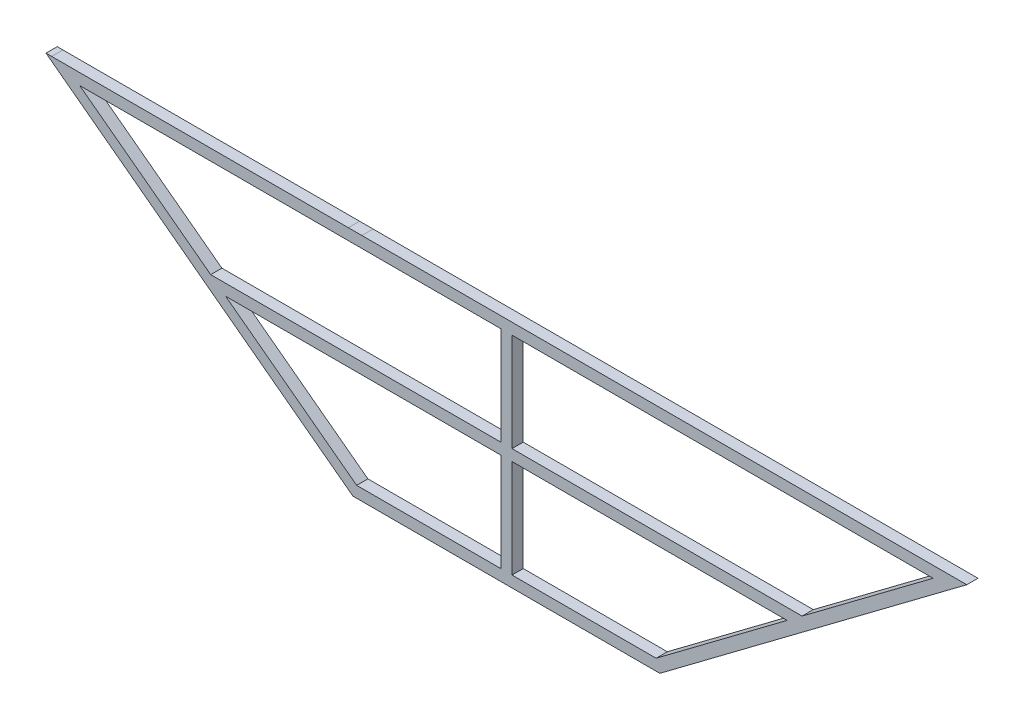
ISO-10303-21;
HEADER;
FILE_DESCRIPTION(('STEP AP214'),'2;1');
FILE_NAME('part.step','',(''),(''),'','','');
FILE_SCHEMA(('AUTOMOTIVE_DESIGN { 1 0 10303 214 1 1 1 1 }'));
ENDSEC;
DATA;
#1=APPLICATION_CONTEXT('core data for automotive mechanical design processes');
#2=APPLICATION_PROTOCOL_DEFINITION('international standard','automotive_design',2000,#1);
#3=PRODUCT_CONTEXT('',#1,'mechanical');
#4=PRODUCT('Part','Part','',(#3));
#5=PRODUCT_RELATED_PRODUCT_CATEGORY('part','',(#4));
#6=PRODUCT_DEFINITION_FORMATION('','',#4);
#7=PRODUCT_DEFINITION_CONTEXT('part definition',#1,'design');
#8=PRODUCT_DEFINITION('design','',#6,#7);
#9=PRODUCT_DEFINITION_SHAPE('','',#8);
#10=(LENGTH_UNIT() NAMED_UNIT(*) SI_UNIT(.MILLI.,.METRE.));
#11=(NAMED_UNIT(*) PLANE_ANGLE_UNIT() SI_UNIT($,.RADIAN.));
#12=(NAMED_UNIT(*) SI_UNIT($,.STERADIAN.) SOLID_ANGLE_UNIT());
#13=UNCERTAINTY_MEASURE_WITH_UNIT(LENGTH_MEASURE(1.E-05),#10,'distance_accuracy_value','');
#14=(GEOMETRIC_REPRESENTATION_CONTEXT(3) GLOBAL_UNCERTAINTY_ASSIGNED_CONTEXT((#13)) GLOBAL_UNIT_ASSIGNED_CONTEXT((#10,
#11,#12)) REPRESENTATION_CONTEXT('',''));
#15=CARTESIAN_POINT('',(0.,0.,0.));
#16=DIRECTION('',(0.,0.,1.));
#17=DIRECTION('',(1.,0.,0.));
#18=AXIS2_PLACEMENT_3D('',#15,#16,#17);
#19=CARTESIAN_POINT('',(-800.,300.,14.63));
#20=DIRECTION('',(0.,-1.,0.));
#21=DIRECTION('',(0.,0.,-1.));
#22=AXIS2_PLACEMENT_3D('',#19,#20,#21);
#23=PLANE('',#22);
#24=DIRECTION('',(0.,0.,-1.));
#25=VECTOR('',#24,1.);
#26=CARTESIAN_POINT('',(-792.599312913207,300.,14.63));
#27=LINE('',#26,#25);
#28=CARTESIAN_POINT('',(-792.599312913207,300.,14.63));
#29=VERTEX_POINT('',#28);
#30=CARTESIAN_POINT('',(-792.599312913207,300.,0.));
#31=VERTEX_POINT('',#30);
#32=EDGE_CURVE('E11',#29,#31,#27,.T.);
#33=ORIENTED_EDGE('',*,*,#32,.F.);
#34=DIRECTION('',(-1.,0.,0.));
#35=VECTOR('',#34,1.);
#36=CARTESIAN_POINT('',(-800.,300.,14.63));
#37=LINE('',#36,#35);
#38=CARTESIAN_POINT('',(-405.922639021753,300.,14.63));
#39=VERTEX_POINT('',#38);
#40=EDGE_CURVE('E438',#39,#29,#37,.T.);
#41=ORIENTED_EDGE('',*,*,#40,.F.);
#42=DIRECTION('',(0.,0.,1.));
#43=VECTOR('',#42,1.);
#44=CARTESIAN_POINT('',(-405.922639021753,300.,14.63));
#45=LINE('',#44,#43);
#46=CARTESIAN_POINT('',(-405.922639021753,300.,0.));
#47=VERTEX_POINT('',#46);
#48=EDGE_CURVE('E387',#47,#39,#45,.T.);
#49=ORIENTED_EDGE('',*,*,#48,.F.);
#50=DIRECTION('',(-1.,0.,0.));
#51=VECTOR('',#50,1.);
#52=CARTESIAN_POINT('',(-800.,300.,0.));
#53=LINE('',#52,#51);
#54=EDGE_CURVE('E425',#47,#31,#53,.T.);
#55=ORIENTED_EDGE('',*,*,#54,.T.);
#56=EDGE_LOOP('',(#33,#41,#49,#55));
#57=FACE_BOUND('',#56,.T.);
#58=ADVANCED_FACE('F44',(#57),#23,.F.);
#59=CARTESIAN_POINT('',(0.,0.,14.63));
#60=DIRECTION('',(0.,1.,0.));
#61=DIRECTION('',(-1.,0.,0.));
#62=AXIS2_PLACEMENT_3D('',#59,#60,#61);
#63=PLANE('',#62);
#64=DIRECTION('',(0.,0.,-1.));
#65=VECTOR('',#64,1.);
#66=CARTESIAN_POINT('',(-14.4940912011187,0.,14.63));
#67=LINE('',#66,#65);
#68=CARTESIAN_POINT('',(-14.4940912011187,0.,14.63));
#69=VERTEX_POINT('',#68);
#70=CARTESIAN_POINT('',(-14.4940912011187,0.,0.));
#71=VERTEX_POINT('',#70);
#72=EDGE_CURVE('E53',#69,#71,#67,.T.);
#73=ORIENTED_EDGE('',*,*,#72,.F.);
#74=DIRECTION('',(1.,0.,0.));
#75=VECTOR('',#74,1.);
#76=CARTESIAN_POINT('',(0.,0.,14.63));
#77=LINE('',#76,#75);
#78=CARTESIAN_POINT('',(-388.333806642396,0.,14.63));
#79=VERTEX_POINT('',#78);
#80=EDGE_CURVE('E359',#79,#69,#77,.T.);
#81=ORIENTED_EDGE('',*,*,#80,.F.);
#82=DIRECTION('',(0.,0.,1.));
#83=VECTOR('',#82,1.);
#84=CARTESIAN_POINT('',(-388.333806642396,0.,14.63));
#85=LINE('',#84,#83);
#86=CARTESIAN_POINT('',(-388.333806642396,0.,0.));
#87=VERTEX_POINT('',#86);
#88=EDGE_CURVE('E386',#87,#79,#85,.T.);
#89=ORIENTED_EDGE('',*,*,#88,.F.);
#90=DIRECTION('',(1.,0.,0.));
#91=VECTOR('',#90,1.);
#92=CARTESIAN_POINT('',(0.,0.,0.));
#93=LINE('',#92,#91);
#94=EDGE_CURVE('E373',#87,#71,#93,.T.);
#95=ORIENTED_EDGE('',*,*,#94,.T.);
#96=EDGE_LOOP('',(#73,#81,#89,#95));
#97=FACE_BOUND('',#96,.T.);
#98=ADVANCED_FACE('F413',(#97),#63,.F.);
#99=CARTESIAN_POINT('',(0.,0.,14.63));
#100=VERTEX_POINT('',#99);
#101=EDGE_CURVE('E354',#69,#100,#77,.T.);
#102=ORIENTED_EDGE('',*,*,#101,.F.);
#103=ORIENTED_EDGE('',*,*,#72,.T.);
#104=CARTESIAN_POINT('',(0.,0.,0.));
#105=VERTEX_POINT('',#104);
#106=EDGE_CURVE('E369',#71,#105,#93,.T.);
#107=ORIENTED_EDGE('',*,*,#106,.T.);
#108=DIRECTION('',(0.,0.,-1.));
#109=VECTOR('',#108,1.);
#110=CARTESIAN_POINT('',(0.,0.,14.63));
#111=LINE('',#110,#109);
#112=EDGE_CURVE('E360',#100,#105,#111,.T.);
#113=ORIENTED_EDGE('',*,*,#112,.F.);
#114=EDGE_LOOP('',(#102,#103,#107,#113));
#115=FACE_BOUND('',#114,.T.);
#116=ADVANCED_FACE('F398',(#115),#63,.F.);
#117=CARTESIAN_POINT('',(-800.,300.,14.63));
#118=VERTEX_POINT('',#117);
#119=EDGE_CURVE('E350',#29,#118,#37,.T.);
#120=ORIENTED_EDGE('',*,*,#119,.F.);
#121=ORIENTED_EDGE('',*,*,#32,.T.);
#122=CARTESIAN_POINT('',(-800.,300.,0.));
#123=VERTEX_POINT('',#122);
#124=EDGE_CURVE('E361',#31,#123,#53,.T.);
#125=ORIENTED_EDGE('',*,*,#124,.T.);
#126=DIRECTION('',(0.,0.,-1.));
#127=VECTOR('',#126,1.);
#128=CARTESIAN_POINT('',(-800.,300.,14.63));
#129=LINE('',#128,#127);
#130=EDGE_CURVE('E378',#118,#123,#129,.T.);
#131=ORIENTED_EDGE('',*,*,#130,.F.);
#132=EDGE_LOOP('',(#120,#121,#125,#131));
#133=FACE_BOUND('',#132,.T.);
#134=ADVANCED_FACE('F422',(#133),#23,.F.);
#135=DIRECTION('',(0.,0.,-1.));
#136=VECTOR('',#135,1.);
#137=CARTESIAN_POINT('',(-388.333806642396,300.,14.63));
#138=LINE('',#137,#136);
#139=CARTESIAN_POINT('',(-388.333806642396,300.,14.63));
#140=VERTEX_POINT('',#139);
#141=CARTESIAN_POINT('',(-388.333806642396,300.,0.));
#142=VERTEX_POINT('',#141);
#143=EDGE_CURVE('E383',#140,#142,#138,.T.);
#144=ORIENTED_EDGE('',*,*,#143,.F.);
#145=CARTESIAN_POINT('',(400.,300.,14.63));
#146=VERTEX_POINT('',#145);
#147=EDGE_CURVE('E347',#146,#140,#37,.T.);
#148=ORIENTED_EDGE('',*,*,#147,.F.);
#149=DIRECTION('',(0.,0.,-1.));
#150=VECTOR('',#149,1.);
#151=CARTESIAN_POINT('',(400.,300.,14.63));
#152=LINE('',#151,#150);
#153=CARTESIAN_POINT('',(400.,300.,0.));
#154=VERTEX_POINT('',#153);
#155=EDGE_CURVE('E385',#146,#154,#152,.T.);
#156=ORIENTED_EDGE('',*,*,#155,.T.);
#157=EDGE_CURVE('E364',#154,#142,#53,.T.);
#158=ORIENTED_EDGE('',*,*,#157,.T.);
#159=EDGE_LOOP('',(#144,#148,#156,#158));
#160=FACE_BOUND('',#159,.T.);
#161=ADVANCED_FACE('F431',(#160),#23,.F.);
#162=CARTESIAN_POINT('',(0.,0.,14.63));
#163=DIRECTION('',(0.,0.,-1.));
#164=DIRECTION('',(-1.,0.,0.));
#165=AXIS2_PLACEMENT_3D('',#162,#163,#164);
#166=PLANE('',#165);
#167=DIRECTION('',(1.,0.,0.));
#168=VECTOR('',#167,1.);
#169=CARTESIAN_POINT('',(-575.616666666667,157.315,14.63));
#170=LINE('',#169,#168);
#171=CARTESIAN_POINT('',(-585.37,157.315,14.63));
#172=VERTEX_POINT('',#171);
#173=CARTESIAN_POINT('',(-207.315,157.315,14.63));
#174=VERTEX_POINT('',#173);
#175=EDGE_CURVE('E254',#172,#174,#170,.T.);
#176=ORIENTED_EDGE('',*,*,#175,.F.);
#177=DIRECTION('',(0.8,-0.6,0.));
#178=VECTOR('',#177,1.);
#179=CARTESIAN_POINT('',(-585.37,157.315,14.63));
#180=LINE('',#179,#178);
#181=CARTESIAN_POINT('',(-756.11,285.37,14.63));
#182=VERTEX_POINT('',#181);
#183=EDGE_CURVE('E263',#182,#172,#180,.T.);
#184=ORIENTED_EDGE('',*,*,#183,.F.);
#185=DIRECTION('',(-1.,0.,0.));
#186=VECTOR('',#185,1.);
#187=CARTESIAN_POINT('',(-756.11,285.37,14.63));
#188=LINE('',#187,#186);
#189=CARTESIAN_POINT('',(-207.315,285.37,14.63));
#190=VERTEX_POINT('',#189);
#191=EDGE_CURVE('E259',#190,#182,#188,.T.);
#192=ORIENTED_EDGE('',*,*,#191,.F.);
#193=DIRECTION('',(0.,1.,0.));
#194=VECTOR('',#193,1.);
#195=CARTESIAN_POINT('',(-207.315,157.315,14.63));
#196=LINE('',#195,#194);
#197=EDGE_CURVE('E253',#174,#190,#196,.T.);
#198=ORIENTED_EDGE('',*,*,#197,.F.);
#199=EDGE_LOOP('',(#176,#184,#192,#198));
#200=FACE_BOUND('',#199,.T.);
#201=DIRECTION('',(0.,-1.,0.));
#202=VECTOR('',#201,1.);
#203=CARTESIAN_POINT('',(-192.685,14.63,14.63));
#204=LINE('',#203,#202);
#205=CARTESIAN_POINT('',(-192.685,142.685,14.63));
#206=VERTEX_POINT('',#205);
#207=CARTESIAN_POINT('',(-192.685,14.63,14.63));
#208=VERTEX_POINT('',#207);
#209=EDGE_CURVE('E312',#206,#208,#204,.T.);
#210=ORIENTED_EDGE('',*,*,#209,.F.);
#211=DIRECTION('',(-1.,0.,0.));
#212=VECTOR('',#211,1.);
#213=CARTESIAN_POINT('',(-192.685,142.685,14.63));
#214=LINE('',#213,#212);
#215=CARTESIAN_POINT('',(165.863333333333,142.685,14.63));
#216=VERTEX_POINT('',#215);
#217=EDGE_CURVE('E322',#216,#206,#214,.T.);
#218=ORIENTED_EDGE('',*,*,#217,.F.);
#219=DIRECTION('',(0.8,0.6,0.));
#220=VECTOR('',#219,1.);
#221=CARTESIAN_POINT('',(165.863333333333,142.685,14.63));
#222=LINE('',#221,#220);
#223=CARTESIAN_POINT('',(-4.87666666666669,14.63,14.63));
#224=VERTEX_POINT('',#223);
#225=EDGE_CURVE('E319',#224,#216,#222,.T.);
#226=ORIENTED_EDGE('',*,*,#225,.F.);
#227=DIRECTION('',(1.,0.,0.));
#228=VECTOR('',#227,1.);
#229=CARTESIAN_POINT('',(-4.87666666666669,14.63,14.63));
#230=LINE('',#229,#228);
#231=EDGE_CURVE('E314',#208,#224,#230,.T.);
#232=ORIENTED_EDGE('',*,*,#231,.F.);
#233=EDGE_LOOP('',(#210,#218,#226,#232));
#234=FACE_BOUND('',#233,.T.);
#235=DIRECTION('',(0.8,0.6,0.));
#236=VECTOR('',#235,1.);
#237=CARTESIAN_POINT('',(400.,300.,14.63));
#238=LINE('',#237,#236);
#239=EDGE_CURVE('E341',#100,#146,#238,.T.);
#240=ORIENTED_EDGE('',*,*,#239,.T.);
#241=ORIENTED_EDGE('',*,*,#147,.T.);
#242=EDGE_CURVE('E352',#140,#39,#37,.T.);
#243=ORIENTED_EDGE('',*,*,#242,.T.);
#244=ORIENTED_EDGE('',*,*,#40,.T.);
#245=ORIENTED_EDGE('',*,*,#119,.T.);
#246=DIRECTION('',(0.8,-0.6,0.));
#247=VECTOR('',#246,1.);
#248=CARTESIAN_POINT('',(-400.,0.,14.63));
#249=LINE('',#248,#247);
#250=CARTESIAN_POINT('',(-400.,0.,14.63));
#251=VERTEX_POINT('',#250);
#252=EDGE_CURVE('E355',#118,#251,#249,.T.);
#253=ORIENTED_EDGE('',*,*,#252,.T.);
#254=EDGE_CURVE('E358',#251,#79,#77,.T.);
#255=ORIENTED_EDGE('',*,*,#254,.T.);
#256=ORIENTED_EDGE('',*,*,#80,.T.);
#257=ORIENTED_EDGE('',*,*,#101,.T.);
#258=EDGE_LOOP('',(#240,#241,#243,#244,#245,#253,#255,#256,#257));
#259=FACE_BOUND('',#258,.T.);
#260=DIRECTION('',(0.,-1.,0.));
#261=VECTOR('',#260,1.);
#262=CARTESIAN_POINT('',(-192.685,157.315,14.63));
#263=LINE('',#262,#261);
#264=CARTESIAN_POINT('',(-192.685,285.37,14.63));
#265=VERTEX_POINT('',#264);
#266=CARTESIAN_POINT('',(-192.685,157.315,14.63));
#267=VERTEX_POINT('',#266);
#268=EDGE_CURVE('E285',#265,#267,#263,.T.);
#269=ORIENTED_EDGE('',*,*,#268,.F.);
#270=DIRECTION('',(-1.,0.,0.));
#271=VECTOR('',#270,1.);
#272=CARTESIAN_POINT('',(-192.685,285.37,14.63));
#273=LINE('',#272,#271);
#274=CARTESIAN_POINT('',(356.11,285.37,14.63));
#275=VERTEX_POINT('',#274);
#276=EDGE_CURVE('E289',#275,#265,#273,.T.);
#277=ORIENTED_EDGE('',*,*,#276,.F.);
#278=DIRECTION('',(0.8,0.6,0.));
#279=VECTOR('',#278,1.);
#280=CARTESIAN_POINT('',(356.11,285.37,14.63));
#281=LINE('',#280,#279);
#282=CARTESIAN_POINT('',(185.37,157.315,14.63));
#283=VERTEX_POINT('',#282);
#284=EDGE_CURVE('E290',#283,#275,#281,.T.);
#285=ORIENTED_EDGE('',*,*,#284,.F.);
#286=DIRECTION('',(1.,0.,0.));
#287=VECTOR('',#286,1.);
#288=CARTESIAN_POINT('',(-192.685,157.315,14.63));
#289=LINE('',#288,#287);
#290=EDGE_CURVE('E282',#267,#283,#289,.T.);
#291=ORIENTED_EDGE('',*,*,#290,.F.);
#292=EDGE_LOOP('',(#269,#277,#285,#291));
#293=FACE_BOUND('',#292,.T.);
#294=DIRECTION('',(1.,0.,0.));
#295=VECTOR('',#294,1.);
#296=CARTESIAN_POINT('',(-207.315,14.63,14.63));
#297=LINE('',#296,#295);
#298=CARTESIAN_POINT('',(-395.123333333333,14.63,14.63));
#299=VERTEX_POINT('',#298);
#300=CARTESIAN_POINT('',(-207.315,14.63,14.63));
#301=VERTEX_POINT('',#300);
#302=EDGE_CURVE('E212',#299,#301,#297,.T.);
#303=ORIENTED_EDGE('',*,*,#302,.F.);
#304=DIRECTION('',(0.8,-0.6,0.));
#305=VECTOR('',#304,1.);
#306=CARTESIAN_POINT('',(-395.123333333333,14.63,14.63));
#307=LINE('',#306,#305);
#308=CARTESIAN_POINT('',(-565.863333333333,142.685,14.63));
#309=VERTEX_POINT('',#308);
#310=EDGE_CURVE('E240',#309,#299,#307,.T.);
#311=ORIENTED_EDGE('',*,*,#310,.F.);
#312=DIRECTION('',(-1.,0.,0.));
#313=VECTOR('',#312,1.);
#314=CARTESIAN_POINT('',(-565.863333333333,142.685,14.63));
#315=LINE('',#314,#313);
#316=CARTESIAN_POINT('',(-207.315,142.685,14.63));
#317=VERTEX_POINT('',#316);
#318=EDGE_CURVE('E232',#317,#309,#315,.T.);
#319=ORIENTED_EDGE('',*,*,#318,.F.);
#320=DIRECTION('',(0.,1.,0.));
#321=VECTOR('',#320,1.);
#322=CARTESIAN_POINT('',(-207.315,14.63,14.63));
#323=LINE('',#322,#321);
#324=EDGE_CURVE('E221',#301,#317,#323,.T.);
#325=ORIENTED_EDGE('',*,*,#324,.F.);
#326=EDGE_LOOP('',(#303,#311,#319,#325));
#327=FACE_BOUND('',#326,.T.);
#328=ADVANCED_FACE('F231',(#200,#234,#259,#293,#327),#166,.F.);
#329=CARTESIAN_POINT('',(0.,0.,0.));
#330=DIRECTION('',(0.,0.,-1.));
#331=DIRECTION('',(-1.,0.,0.));
#332=AXIS2_PLACEMENT_3D('',#329,#330,#331);
#333=PLANE('',#332);
#334=DIRECTION('',(0.8,0.6,0.));
#335=VECTOR('',#334,1.);
#336=CARTESIAN_POINT('',(400.,300.,0.));
#337=LINE('',#336,#335);
#338=EDGE_CURVE('E344',#105,#154,#337,.T.);
#339=ORIENTED_EDGE('',*,*,#338,.F.);
#340=ORIENTED_EDGE('',*,*,#106,.F.);
#341=ORIENTED_EDGE('',*,*,#94,.F.);
#342=CARTESIAN_POINT('',(-400.,0.,0.));
#343=VERTEX_POINT('',#342);
#344=EDGE_CURVE('E346',#343,#87,#93,.T.);
#345=ORIENTED_EDGE('',*,*,#344,.F.);
#346=DIRECTION('',(0.8,-0.6,0.));
#347=VECTOR('',#346,1.);
#348=CARTESIAN_POINT('',(-400.,0.,0.));
#349=LINE('',#348,#347);
#350=EDGE_CURVE('E370',#123,#343,#349,.T.);
#351=ORIENTED_EDGE('',*,*,#350,.F.);
#352=ORIENTED_EDGE('',*,*,#124,.F.);
#353=ORIENTED_EDGE('',*,*,#54,.F.);
#354=EDGE_CURVE('E368',#142,#47,#53,.T.);
#355=ORIENTED_EDGE('',*,*,#354,.F.);
#356=ORIENTED_EDGE('',*,*,#157,.F.);
#357=EDGE_LOOP('',(#339,#340,#341,#345,#351,#352,#353,#355,#356));
#358=FACE_BOUND('',#357,.T.);
#359=DIRECTION('',(-1.,0.,0.));
#360=VECTOR('',#359,1.);
#361=CARTESIAN_POINT('',(-192.685,142.685,0.));
#362=LINE('',#361,#360);
#363=CARTESIAN_POINT('',(165.863333333333,142.685,0.));
#364=VERTEX_POINT('',#363);
#365=CARTESIAN_POINT('',(-192.685,142.685,0.));
#366=VERTEX_POINT('',#365);
#367=EDGE_CURVE('E317',#364,#366,#362,.T.);
#368=ORIENTED_EDGE('',*,*,#367,.T.);
#369=DIRECTION('',(0.,-1.,0.));
#370=VECTOR('',#369,1.);
#371=CARTESIAN_POINT('',(-192.685,14.63,0.));
#372=LINE('',#371,#370);
#373=CARTESIAN_POINT('',(-192.685,14.63,0.));
#374=VERTEX_POINT('',#373);
#375=EDGE_CURVE('E315',#366,#374,#372,.T.);
#376=ORIENTED_EDGE('',*,*,#375,.T.);
#377=DIRECTION('',(1.,0.,0.));
#378=VECTOR('',#377,1.);
#379=CARTESIAN_POINT('',(-4.87666666666669,14.63,0.));
#380=LINE('',#379,#378);
#381=CARTESIAN_POINT('',(-4.87666666666669,14.63,0.));
#382=VERTEX_POINT('',#381);
#383=EDGE_CURVE('E328',#374,#382,#380,.T.);
#384=ORIENTED_EDGE('',*,*,#383,.T.);
#385=DIRECTION('',(0.8,0.6,0.));
#386=VECTOR('',#385,1.);
#387=CARTESIAN_POINT('',(165.863333333333,142.685,0.));
#388=LINE('',#387,#386);
#389=EDGE_CURVE('E327',#382,#364,#388,.T.);
#390=ORIENTED_EDGE('',*,*,#389,.T.);
#391=EDGE_LOOP('',(#368,#376,#384,#390));
#392=FACE_BOUND('',#391,.T.);
#393=DIRECTION('',(-1.,0.,0.));
#394=VECTOR('',#393,1.);
#395=CARTESIAN_POINT('',(-192.685,285.37,0.));
#396=LINE('',#395,#394);
#397=CARTESIAN_POINT('',(356.11,285.37,0.));
#398=VERTEX_POINT('',#397);
#399=CARTESIAN_POINT('',(-192.685,285.37,0.));
#400=VERTEX_POINT('',#399);
#401=EDGE_CURVE('E284',#398,#400,#396,.T.);
#402=ORIENTED_EDGE('',*,*,#401,.T.);
#403=DIRECTION('',(0.,-1.,0.));
#404=VECTOR('',#403,1.);
#405=CARTESIAN_POINT('',(-192.685,157.315,0.));
#406=LINE('',#405,#404);
#407=CARTESIAN_POINT('',(-192.685,157.315,0.));
#408=VERTEX_POINT('',#407);
#409=EDGE_CURVE('E283',#400,#408,#406,.T.);
#410=ORIENTED_EDGE('',*,*,#409,.T.);
#411=DIRECTION('',(1.,0.,0.));
#412=VECTOR('',#411,1.);
#413=CARTESIAN_POINT('',(175.161951026694,157.315,0.));
#414=LINE('',#413,#412);
#415=CARTESIAN_POINT('',(185.37,157.315,0.));
#416=VERTEX_POINT('',#415);
#417=EDGE_CURVE('E294',#408,#416,#414,.T.);
#418=ORIENTED_EDGE('',*,*,#417,.T.);
#419=DIRECTION('',(0.8,0.6,0.));
#420=VECTOR('',#419,1.);
#421=CARTESIAN_POINT('',(356.11,285.37,0.));
#422=LINE('',#421,#420);
#423=EDGE_CURVE('E296',#416,#398,#422,.T.);
#424=ORIENTED_EDGE('',*,*,#423,.T.);
#425=EDGE_LOOP('',(#402,#410,#418,#424));
#426=FACE_BOUND('',#425,.T.);
#427=DIRECTION('',(0.8,-0.6,0.));
#428=VECTOR('',#427,1.);
#429=CARTESIAN_POINT('',(-585.37,157.315,0.));
#430=LINE('',#429,#428);
#431=CARTESIAN_POINT('',(-756.11,285.37,0.));
#432=VERTEX_POINT('',#431);
#433=CARTESIAN_POINT('',(-585.37,157.315,0.));
#434=VERTEX_POINT('',#433);
#435=EDGE_CURVE('E257',#432,#434,#430,.T.);
#436=ORIENTED_EDGE('',*,*,#435,.T.);
#437=DIRECTION('',(1.,0.,0.));
#438=VECTOR('',#437,1.);
#439=CARTESIAN_POINT('',(-575.616666666667,157.315,0.));
#440=LINE('',#439,#438);
#441=CARTESIAN_POINT('',(-207.315,157.315,0.));
#442=VERTEX_POINT('',#441);
#443=EDGE_CURVE('E230',#434,#442,#440,.T.);
#444=ORIENTED_EDGE('',*,*,#443,.T.);
#445=DIRECTION('',(0.,1.,0.));
#446=VECTOR('',#445,1.);
#447=CARTESIAN_POINT('',(-207.315,157.315,0.));
#448=LINE('',#447,#446);
#449=CARTESIAN_POINT('',(-207.315,285.37,0.));
#450=VERTEX_POINT('',#449);
#451=EDGE_CURVE('E266',#442,#450,#448,.T.);
#452=ORIENTED_EDGE('',*,*,#451,.T.);
#453=DIRECTION('',(-1.,0.,0.));
#454=VECTOR('',#453,1.);
#455=CARTESIAN_POINT('',(-756.11,285.37,0.));
#456=LINE('',#455,#454);
#457=EDGE_CURVE('E268',#450,#432,#456,.T.);
#458=ORIENTED_EDGE('',*,*,#457,.T.);
#459=EDGE_LOOP('',(#436,#444,#452,#458));
#460=FACE_BOUND('',#459,.T.);
#461=DIRECTION('',(0.8,-0.6,0.));
#462=VECTOR('',#461,1.);
#463=CARTESIAN_POINT('',(-395.123333333333,14.63,0.));
#464=LINE('',#463,#462);
#465=CARTESIAN_POINT('',(-565.863333333333,142.685,0.));
#466=VERTEX_POINT('',#465);
#467=CARTESIAN_POINT('',(-395.123333333333,14.63,0.));
#468=VERTEX_POINT('',#467);
#469=EDGE_CURVE('E225',#466,#468,#464,.T.);
#470=ORIENTED_EDGE('',*,*,#469,.T.);
#471=DIRECTION('',(1.,0.,0.));
#472=VECTOR('',#471,1.);
#473=CARTESIAN_POINT('',(-207.315,14.63,0.));
#474=LINE('',#473,#472);
#475=CARTESIAN_POINT('',(-207.315,14.63,0.));
#476=VERTEX_POINT('',#475);
#477=EDGE_CURVE('E241',#468,#476,#474,.T.);
#478=ORIENTED_EDGE('',*,*,#477,.T.);
#479=DIRECTION('',(0.,1.,0.));
#480=VECTOR('',#479,1.);
#481=CARTESIAN_POINT('',(-207.315,14.63,0.));
#482=LINE('',#481,#480);
#483=CARTESIAN_POINT('',(-207.315,142.685,0.));
#484=VERTEX_POINT('',#483);
#485=EDGE_CURVE('E226',#476,#484,#482,.T.);
#486=ORIENTED_EDGE('',*,*,#485,.T.);
#487=DIRECTION('',(-1.,0.,0.));
#488=VECTOR('',#487,1.);
#489=CARTESIAN_POINT('',(-565.863333333333,142.685,0.));
#490=LINE('',#489,#488);
#491=EDGE_CURVE('E242',#484,#466,#490,.T.);
#492=ORIENTED_EDGE('',*,*,#491,.T.);
#493=EDGE_LOOP('',(#470,#478,#486,#492));
#494=FACE_BOUND('',#493,.T.);
#495=ADVANCED_FACE('F409',(#358,#392,#426,#460,#494),#333,.T.);
#496=CARTESIAN_POINT('',(400.,300.,14.63));
#497=DIRECTION('',(-0.6,0.8,0.));
#498=DIRECTION('',(-0.8,-0.6,0.));
#499=AXIS2_PLACEMENT_3D('',#496,#497,#498);
#500=PLANE('',#499);
#501=ORIENTED_EDGE('',*,*,#338,.T.);
#502=ORIENTED_EDGE('',*,*,#155,.F.);
#503=ORIENTED_EDGE('',*,*,#239,.F.);
#504=ORIENTED_EDGE('',*,*,#112,.T.);
#505=EDGE_LOOP('',(#501,#502,#503,#504));
#506=FACE_BOUND('',#505,.T.);
#507=ADVANCED_FACE('F50',(#506),#500,.F.);
#508=ORIENTED_EDGE('',*,*,#354,.T.);
#509=ORIENTED_EDGE('',*,*,#48,.T.);
#510=ORIENTED_EDGE('',*,*,#242,.F.);
#511=ORIENTED_EDGE('',*,*,#143,.T.);
#512=EDGE_LOOP('',(#508,#509,#510,#511));
#513=FACE_BOUND('',#512,.T.);
#514=ADVANCED_FACE('F426',(#513),#23,.F.);
#515=CARTESIAN_POINT('',(-400.,0.,14.63));
#516=DIRECTION('',(0.6,0.8,0.));
#517=DIRECTION('',(-0.8,0.6,0.));
#518=AXIS2_PLACEMENT_3D('',#515,#516,#517);
#519=PLANE('',#518);
#520=ORIENTED_EDGE('',*,*,#350,.T.);
#521=DIRECTION('',(0.,0.,-1.));
#522=VECTOR('',#521,1.);
#523=CARTESIAN_POINT('',(-400.,0.,14.63));
#524=LINE('',#523,#522);
#525=EDGE_CURVE('E376',#251,#343,#524,.T.);
#526=ORIENTED_EDGE('',*,*,#525,.F.);
#527=ORIENTED_EDGE('',*,*,#252,.F.);
#528=ORIENTED_EDGE('',*,*,#130,.T.);
#529=EDGE_LOOP('',(#520,#526,#527,#528));
#530=FACE_BOUND('',#529,.T.);
#531=ADVANCED_FACE('F418',(#530),#519,.F.);
#532=ORIENTED_EDGE('',*,*,#344,.T.);
#533=ORIENTED_EDGE('',*,*,#88,.T.);
#534=ORIENTED_EDGE('',*,*,#254,.F.);
#535=ORIENTED_EDGE('',*,*,#525,.T.);
#536=EDGE_LOOP('',(#532,#533,#534,#535));
#537=FACE_BOUND('',#536,.T.);
#538=ADVANCED_FACE('F412',(#537),#63,.F.);
#539=CARTESIAN_POINT('',(-192.685,14.63,14.63));
#540=DIRECTION('',(1.,0.,0.));
#541=DIRECTION('',(0.,1.,0.));
#542=AXIS2_PLACEMENT_3D('',#539,#540,#541);
#543=PLANE('',#542);
#544=ORIENTED_EDGE('',*,*,#375,.F.);
#545=DIRECTION('',(0.,0.,-1.));
#546=VECTOR('',#545,1.);
#547=CARTESIAN_POINT('',(-192.685,142.685,14.63));
#548=LINE('',#547,#546);
#549=EDGE_CURVE('E324',#206,#366,#548,.T.);
#550=ORIENTED_EDGE('',*,*,#549,.F.);
#551=ORIENTED_EDGE('',*,*,#209,.T.);
#552=DIRECTION('',(0.,0.,-1.));
#553=VECTOR('',#552,1.);
#554=CARTESIAN_POINT('',(-192.685,14.63,14.63));
#555=LINE('',#554,#553);
#556=EDGE_CURVE('E338',#208,#374,#555,.T.);
#557=ORIENTED_EDGE('',*,*,#556,.T.);
#558=EDGE_LOOP('',(#544,#550,#551,#557));
#559=FACE_BOUND('',#558,.T.);
#560=ADVANCED_FACE('F470',(#559),#543,.T.);
#561=CARTESIAN_POINT('',(-4.87666666666669,14.63,14.63));
#562=DIRECTION('',(0.,1.,0.));
#563=DIRECTION('',(0.,0.,1.));
#564=AXIS2_PLACEMENT_3D('',#561,#562,#563);
#565=PLANE('',#564);
#566=ORIENTED_EDGE('',*,*,#383,.F.);
#567=ORIENTED_EDGE('',*,*,#556,.F.);
#568=ORIENTED_EDGE('',*,*,#231,.T.);
#569=DIRECTION('',(0.,0.,-1.));
#570=VECTOR('',#569,1.);
#571=CARTESIAN_POINT('',(-4.87666666666669,14.63,14.63));
#572=LINE('',#571,#570);
#573=EDGE_CURVE('E336',#224,#382,#572,.T.);
#574=ORIENTED_EDGE('',*,*,#573,.T.);
#575=EDGE_LOOP('',(#566,#567,#568,#574));
#576=FACE_BOUND('',#575,.T.);
#577=ADVANCED_FACE('F475',(#576),#565,.T.);
#578=CARTESIAN_POINT('',(165.863333333333,142.685,14.63));
#579=DIRECTION('',(-0.6,0.8,0.));
#580=DIRECTION('',(-0.8,-0.6,0.));
#581=AXIS2_PLACEMENT_3D('',#578,#579,#580);
#582=PLANE('',#581);
#583=ORIENTED_EDGE('',*,*,#389,.F.);
#584=ORIENTED_EDGE('',*,*,#573,.F.);
#585=ORIENTED_EDGE('',*,*,#225,.T.);
#586=DIRECTION('',(0.,0.,-1.));
#587=VECTOR('',#586,1.);
#588=CARTESIAN_POINT('',(165.863333333333,142.685,14.63));
#589=LINE('',#588,#587);
#590=EDGE_CURVE('E337',#216,#364,#589,.T.);
#591=ORIENTED_EDGE('',*,*,#590,.T.);
#592=EDGE_LOOP('',(#583,#584,#585,#591));
#593=FACE_BOUND('',#592,.T.);
#594=ADVANCED_FACE('F624',(#593),#582,.T.);
#595=CARTESIAN_POINT('',(-192.685,142.685,14.63));
#596=DIRECTION('',(0.,-1.,0.));
#597=DIRECTION('',(0.,0.,-1.));
#598=AXIS2_PLACEMENT_3D('',#595,#596,#597);
#599=PLANE('',#598);
#600=ORIENTED_EDGE('',*,*,#367,.F.);
#601=ORIENTED_EDGE('',*,*,#590,.F.);
#602=ORIENTED_EDGE('',*,*,#217,.T.);
#603=ORIENTED_EDGE('',*,*,#549,.T.);
#604=EDGE_LOOP('',(#600,#601,#602,#603));
#605=FACE_BOUND('',#604,.T.);
#606=ADVANCED_FACE('F614',(#605),#599,.T.);
#607=CARTESIAN_POINT('',(-192.685,157.315,14.63));
#608=DIRECTION('',(1.,0.,0.));
#609=DIRECTION('',(0.,1.,0.));
#610=AXIS2_PLACEMENT_3D('',#607,#608,#609);
#611=PLANE('',#610);
#612=ORIENTED_EDGE('',*,*,#409,.F.);
#613=DIRECTION('',(0.,0.,-1.));
#614=VECTOR('',#613,1.);
#615=CARTESIAN_POINT('',(-192.685,285.37,14.63));
#616=LINE('',#615,#614);
#617=EDGE_CURVE('E292',#265,#400,#616,.T.);
#618=ORIENTED_EDGE('',*,*,#617,.F.);
#619=ORIENTED_EDGE('',*,*,#268,.T.);
#620=DIRECTION('',(0.,0.,-1.));
#621=VECTOR('',#620,1.);
#622=CARTESIAN_POINT('',(-192.685,157.315,14.63));
#623=LINE('',#622,#621);
#624=EDGE_CURVE('E307',#267,#408,#623,.T.);
#625=ORIENTED_EDGE('',*,*,#624,.T.);
#626=EDGE_LOOP('',(#612,#618,#619,#625));
#627=FACE_BOUND('',#626,.T.);
#628=ADVANCED_FACE('F608',(#627),#611,.T.);
#629=CARTESIAN_POINT('',(175.161951026694,157.315,14.63));
#630=DIRECTION('',(0.,1.,0.));
#631=DIRECTION('',(-1.,0.,0.));
#632=AXIS2_PLACEMENT_3D('',#629,#630,#631);
#633=PLANE('',#632);
#634=ORIENTED_EDGE('',*,*,#417,.F.);
#635=ORIENTED_EDGE('',*,*,#624,.F.);
#636=ORIENTED_EDGE('',*,*,#290,.T.);
#637=DIRECTION('',(0.,0.,-1.));
#638=VECTOR('',#637,1.);
#639=CARTESIAN_POINT('',(185.37,157.315,14.63));
#640=LINE('',#639,#638);
#641=EDGE_CURVE('E310',#283,#416,#640,.T.);
#642=ORIENTED_EDGE('',*,*,#641,.T.);
#643=EDGE_LOOP('',(#634,#635,#636,#642));
#644=FACE_BOUND('',#643,.T.);
#645=ADVANCED_FACE('F597',(#644),#633,.T.);
#646=CARTESIAN_POINT('',(356.11,285.37,14.63));
#647=DIRECTION('',(-0.6,0.8,0.));
#648=DIRECTION('',(-0.8,-0.6,0.));
#649=AXIS2_PLACEMENT_3D('',#646,#647,#648);
#650=PLANE('',#649);
#651=ORIENTED_EDGE('',*,*,#423,.F.);
#652=ORIENTED_EDGE('',*,*,#641,.F.);
#653=ORIENTED_EDGE('',*,*,#284,.T.);
#654=DIRECTION('',(0.,0.,-1.));
#655=VECTOR('',#654,1.);
#656=CARTESIAN_POINT('',(356.11,285.37,14.63));
#657=LINE('',#656,#655);
#658=EDGE_CURVE('E304',#275,#398,#657,.T.);
#659=ORIENTED_EDGE('',*,*,#658,.T.);
#660=EDGE_LOOP('',(#651,#652,#653,#659));
#661=FACE_BOUND('',#660,.T.);
#662=ADVANCED_FACE('F590',(#661),#650,.T.);
#663=CARTESIAN_POINT('',(-192.685,285.37,14.63));
#664=DIRECTION('',(0.,-1.,0.));
#665=DIRECTION('',(0.,0.,-1.));
#666=AXIS2_PLACEMENT_3D('',#663,#664,#665);
#667=PLANE('',#666);
#668=ORIENTED_EDGE('',*,*,#401,.F.);
#669=ORIENTED_EDGE('',*,*,#658,.F.);
#670=ORIENTED_EDGE('',*,*,#276,.T.);
#671=ORIENTED_EDGE('',*,*,#617,.T.);
#672=EDGE_LOOP('',(#668,#669,#670,#671));
#673=FACE_BOUND('',#672,.T.);
#674=ADVANCED_FACE('F579',(#673),#667,.T.);
#675=CARTESIAN_POINT('',(-575.616666666667,157.315,14.63));
#676=DIRECTION('',(0.,1.,0.));
#677=DIRECTION('',(0.,0.,1.));
#678=AXIS2_PLACEMENT_3D('',#675,#676,#677);
#679=PLANE('',#678);
#680=ORIENTED_EDGE('',*,*,#443,.F.);
#681=DIRECTION('',(0.,0.,-1.));
#682=VECTOR('',#681,1.);
#683=CARTESIAN_POINT('',(-585.37,157.315,14.63));
#684=LINE('',#683,#682);
#685=EDGE_CURVE('E261',#172,#434,#684,.T.);
#686=ORIENTED_EDGE('',*,*,#685,.F.);
#687=ORIENTED_EDGE('',*,*,#175,.T.);
#688=DIRECTION('',(0.,0.,-1.));
#689=VECTOR('',#688,1.);
#690=CARTESIAN_POINT('',(-207.315,157.315,14.63));
#691=LINE('',#690,#689);
#692=EDGE_CURVE('E276',#174,#442,#691,.T.);
#693=ORIENTED_EDGE('',*,*,#692,.T.);
#694=EDGE_LOOP('',(#680,#686,#687,#693));
#695=FACE_BOUND('',#694,.T.);
#696=ADVANCED_FACE('F568',(#695),#679,.T.);
#697=CARTESIAN_POINT('',(-207.315,157.315,14.63));
#698=DIRECTION('',(-1.,0.,0.));
#699=DIRECTION('',(0.,-1.,0.));
#700=AXIS2_PLACEMENT_3D('',#697,#698,#699);
#701=PLANE('',#700);
#702=ORIENTED_EDGE('',*,*,#451,.F.);
#703=ORIENTED_EDGE('',*,*,#692,.F.);
#704=ORIENTED_EDGE('',*,*,#197,.T.);
#705=DIRECTION('',(0.,0.,-1.));
#706=VECTOR('',#705,1.);
#707=CARTESIAN_POINT('',(-207.315,285.37,14.63));
#708=LINE('',#707,#706);
#709=EDGE_CURVE('E280',#190,#450,#708,.T.);
#710=ORIENTED_EDGE('',*,*,#709,.T.);
#711=EDGE_LOOP('',(#702,#703,#704,#710));
#712=FACE_BOUND('',#711,.T.);
#713=ADVANCED_FACE('F559',(#712),#701,.T.);
#714=CARTESIAN_POINT('',(-756.11,285.37,14.63));
#715=DIRECTION('',(0.,-1.,0.));
#716=DIRECTION('',(0.,0.,-1.));
#717=AXIS2_PLACEMENT_3D('',#714,#715,#716);
#718=PLANE('',#717);
#719=ORIENTED_EDGE('',*,*,#457,.F.);
#720=ORIENTED_EDGE('',*,*,#709,.F.);
#721=ORIENTED_EDGE('',*,*,#191,.T.);
#722=DIRECTION('',(0.,0.,-1.));
#723=VECTOR('',#722,1.);
#724=CARTESIAN_POINT('',(-756.11,285.37,14.63));
#725=LINE('',#724,#723);
#726=EDGE_CURVE('E273',#182,#432,#725,.T.);
#727=ORIENTED_EDGE('',*,*,#726,.T.);
#728=EDGE_LOOP('',(#719,#720,#721,#727));
#729=FACE_BOUND('',#728,.T.);
#730=ADVANCED_FACE('F549',(#729),#718,.T.);
#731=CARTESIAN_POINT('',(-585.37,157.315,14.63));
#732=DIRECTION('',(0.6,0.8,0.));
#733=DIRECTION('',(-0.8,0.6,0.));
#734=AXIS2_PLACEMENT_3D('',#731,#732,#733);
#735=PLANE('',#734);
#736=ORIENTED_EDGE('',*,*,#435,.F.);
#737=ORIENTED_EDGE('',*,*,#726,.F.);
#738=ORIENTED_EDGE('',*,*,#183,.T.);
#739=ORIENTED_EDGE('',*,*,#685,.T.);
#740=EDGE_LOOP('',(#736,#737,#738,#739));
#741=FACE_BOUND('',#740,.T.);
#742=ADVANCED_FACE('F545',(#741),#735,.T.);
#743=CARTESIAN_POINT('',(-207.315,14.63,14.63));
#744=DIRECTION('',(0.,1.,0.));
#745=DIRECTION('',(0.,0.,1.));
#746=AXIS2_PLACEMENT_3D('',#743,#744,#745);
#747=PLANE('',#746);
#748=ORIENTED_EDGE('',*,*,#477,.F.);
#749=DIRECTION('',(0.,0.,-1.));
#750=VECTOR('',#749,1.);
#751=CARTESIAN_POINT('',(-395.123333333333,14.63,14.63));
#752=LINE('',#751,#750);
#753=EDGE_CURVE('E220',#299,#468,#752,.T.);
#754=ORIENTED_EDGE('',*,*,#753,.F.);
#755=ORIENTED_EDGE('',*,*,#302,.T.);
#756=DIRECTION('',(0.,0.,-1.));
#757=VECTOR('',#756,1.);
#758=CARTESIAN_POINT('',(-207.315,14.63,14.63));
#759=LINE('',#758,#757);
#760=EDGE_CURVE('E211',#301,#476,#759,.T.);
#761=ORIENTED_EDGE('',*,*,#760,.T.);
#762=EDGE_LOOP('',(#748,#754,#755,#761));
#763=FACE_BOUND('',#762,.T.);
#764=ADVANCED_FACE('F214',(#763),#747,.T.);
#765=CARTESIAN_POINT('',(-207.315,14.63,14.63));
#766=DIRECTION('',(-1.,0.,0.));
#767=DIRECTION('',(0.,-1.,0.));
#768=AXIS2_PLACEMENT_3D('',#765,#766,#767);
#769=PLANE('',#768);
#770=ORIENTED_EDGE('',*,*,#485,.F.);
#771=ORIENTED_EDGE('',*,*,#760,.F.);
#772=ORIENTED_EDGE('',*,*,#324,.T.);
#773=DIRECTION('',(0.,0.,-1.));
#774=VECTOR('',#773,1.);
#775=CARTESIAN_POINT('',(-207.315,142.685,14.63));
#776=LINE('',#775,#774);
#777=EDGE_CURVE('E229',#317,#484,#776,.T.);
#778=ORIENTED_EDGE('',*,*,#777,.T.);
#779=EDGE_LOOP('',(#770,#771,#772,#778));
#780=FACE_BOUND('',#779,.T.);
#781=ADVANCED_FACE('F224',(#780),#769,.T.);
#782=CARTESIAN_POINT('',(-565.863333333333,142.685,14.63));
#783=DIRECTION('',(0.,-1.,0.));
#784=DIRECTION('',(0.,0.,-1.));
#785=AXIS2_PLACEMENT_3D('',#782,#783,#784);
#786=PLANE('',#785);
#787=ORIENTED_EDGE('',*,*,#491,.F.);
#788=ORIENTED_EDGE('',*,*,#777,.F.);
#789=ORIENTED_EDGE('',*,*,#318,.T.);
#790=DIRECTION('',(0.,0.,-1.));
#791=VECTOR('',#790,1.);
#792=CARTESIAN_POINT('',(-565.863333333333,142.685,14.63));
#793=LINE('',#792,#791);
#794=EDGE_CURVE('E249',#309,#466,#793,.T.);
#795=ORIENTED_EDGE('',*,*,#794,.T.);
#796=EDGE_LOOP('',(#787,#788,#789,#795));
#797=FACE_BOUND('',#796,.T.);
#798=ADVANCED_FACE('F519',(#797),#786,.T.);
#799=CARTESIAN_POINT('',(-395.123333333333,14.63,14.63));
#800=DIRECTION('',(0.6,0.8,0.));
#801=DIRECTION('',(-0.8,0.6,0.));
#802=AXIS2_PLACEMENT_3D('',#799,#800,#801);
#803=PLANE('',#802);
#804=ORIENTED_EDGE('',*,*,#469,.F.);
#805=ORIENTED_EDGE('',*,*,#794,.F.);
#806=ORIENTED_EDGE('',*,*,#310,.T.);
#807=ORIENTED_EDGE('',*,*,#753,.T.);
#808=EDGE_LOOP('',(#804,#805,#806,#807));
#809=FACE_BOUND('',#808,.T.);
#810=ADVANCED_FACE('F513',(#809),#803,.T.);
#811=CLOSED_SHELL('',(#58,#98,#116,#134,#161,#328,#495,#507,#514,#531,#538,#560,#577,#594,#606,
#628,#645,#662,#674,#696,#713,#730,#742,#764,#781,#798,#810));
#812=MANIFOLD_SOLID_BREP('B2',#811);
#813=ADVANCED_BREP_SHAPE_REPRESENTATION('',(#18,#812),#14);
#814=SHAPE_DEFINITION_REPRESENTATION(#9,#813);
ENDSEC;
END-ISO-10303-21;
